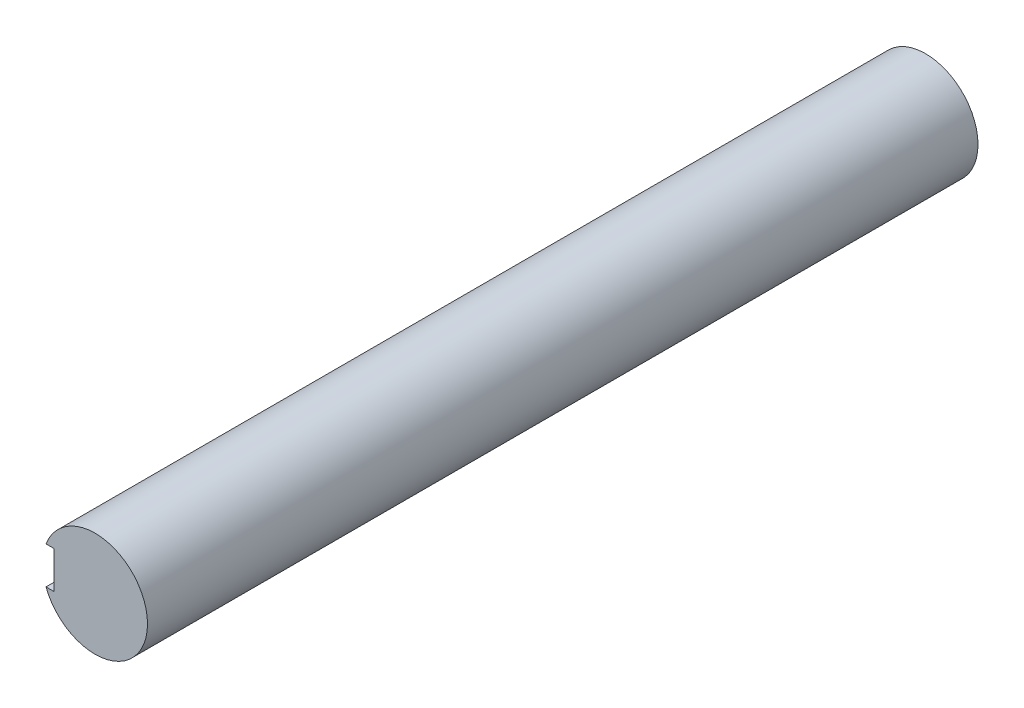
ISO-10303-21;
HEADER;
FILE_DESCRIPTION(('STEP AP214'),'2;1');
FILE_NAME('part.step','',(''),(''),'','','');
FILE_SCHEMA(('AUTOMOTIVE_DESIGN { 1 0 10303 214 1 1 1 1 }'));
ENDSEC;
DATA;
#1=APPLICATION_CONTEXT('core data for automotive mechanical design processes');
#2=APPLICATION_PROTOCOL_DEFINITION('international standard','automotive_design',2000,#1);
#3=PRODUCT_CONTEXT('',#1,'mechanical');
#4=PRODUCT('Part','Part','',(#3));
#5=PRODUCT_RELATED_PRODUCT_CATEGORY('part','',(#4));
#6=PRODUCT_DEFINITION_FORMATION('','',#4);
#7=PRODUCT_DEFINITION_CONTEXT('part definition',#1,'design');
#8=PRODUCT_DEFINITION('design','',#6,#7);
#9=PRODUCT_DEFINITION_SHAPE('','',#8);
#10=(LENGTH_UNIT() NAMED_UNIT(*) SI_UNIT(.MILLI.,.METRE.));
#11=(NAMED_UNIT(*) PLANE_ANGLE_UNIT() SI_UNIT($,.RADIAN.));
#12=(NAMED_UNIT(*) SI_UNIT($,.STERADIAN.) SOLID_ANGLE_UNIT());
#13=UNCERTAINTY_MEASURE_WITH_UNIT(LENGTH_MEASURE(1.E-05),#10,'distance_accuracy_value','');
#14=(GEOMETRIC_REPRESENTATION_CONTEXT(3) GLOBAL_UNCERTAINTY_ASSIGNED_CONTEXT((#13)) GLOBAL_UNIT_ASSIGNED_CONTEXT((#10,
#11,#12)) REPRESENTATION_CONTEXT('',''));
#15=CARTESIAN_POINT('',(0.,0.,0.));
#16=DIRECTION('',(0.,0.,1.));
#17=DIRECTION('',(1.,0.,0.));
#18=AXIS2_PLACEMENT_3D('',#15,#16,#17);
#19=CARTESIAN_POINT('',(-78.6475137895715,-368.822211524712,-10.));
#20=DIRECTION('',(0.,0.,1.));
#21=DIRECTION('',(1.,0.,0.));
#22=AXIS2_PLACEMENT_3D('',#19,#20,#21);
#23=CYLINDRICAL_SURFACE('',#22,6.);
#24=DIRECTION('',(0.,0.,1.));
#25=VECTOR('',#24,1.);
#26=CARTESIAN_POINT('',(-84.2568147629765,-366.692483234587,-10.));
#27=LINE('',#26,#25);
#28=CARTESIAN_POINT('',(-84.2568147629765,-366.692483234587,85.));
#29=VERTEX_POINT('',#28);
#30=CARTESIAN_POINT('',(-84.2568147629765,-366.692483234587,5.));
#31=VERTEX_POINT('',#30);
#32=EDGE_CURVE('E55',#29,#31,#27,.F.);
#33=ORIENTED_EDGE('',*,*,#32,.F.);
#34=CARTESIAN_POINT('',(-78.6475137895715,-368.822211524712,85.));
#35=DIRECTION('',(0.,0.,1.));
#36=DIRECTION('',(1.,0.,0.));
#37=AXIS2_PLACEMENT_3D('',#34,#35,#36);
#38=CIRCLE('',#37,6.);
#39=CARTESIAN_POINT('',(-84.2568147629765,-370.951939814837,85.));
#40=VERTEX_POINT('',#39);
#41=EDGE_CURVE('E100',#40,#29,#38,.T.);
#42=ORIENTED_EDGE('',*,*,#41,.F.);
#43=DIRECTION('',(0.,0.,1.));
#44=VECTOR('',#43,1.);
#45=CARTESIAN_POINT('',(-84.2568147629765,-370.951939814837,-10.));
#46=LINE('',#45,#44);
#47=CARTESIAN_POINT('',(-84.2568147629765,-370.951939814837,5.));
#48=VERTEX_POINT('',#47);
#49=EDGE_CURVE('E47',#48,#40,#46,.T.);
#50=ORIENTED_EDGE('',*,*,#49,.F.);
#51=CARTESIAN_POINT('',(-78.6475137895715,-368.822211524712,5.));
#52=DIRECTION('',(0.,0.,-1.));
#53=DIRECTION('',(-1.,0.,0.));
#54=AXIS2_PLACEMENT_3D('',#51,#52,#53);
#55=CIRCLE('',#54,6.);
#56=EDGE_CURVE('E11',#31,#48,#55,.F.);
#57=ORIENTED_EDGE('',*,*,#56,.F.);
#58=EDGE_LOOP('',(#33,#42,#50,#57));
#59=FACE_BOUND('',#58,.T.);
#60=CARTESIAN_POINT('',(-78.6475137895715,-368.822211524712,-10.));
#61=DIRECTION('',(0.,0.,1.));
#62=DIRECTION('',(1.,0.,0.));
#63=AXIS2_PLACEMENT_3D('',#60,#61,#62);
#64=CIRCLE('',#63,6.);
#65=CARTESIAN_POINT('',(-72.6475137895715,-368.822211524712,-10.));
#66=VERTEX_POINT('',#65);
#67=EDGE_CURVE('E103',#66,#66,#64,.T.);
#68=ORIENTED_EDGE('',*,*,#67,.T.);
#69=EDGE_LOOP('',(#68));
#70=FACE_BOUND('',#69,.T.);
#71=ADVANCED_FACE('F33',(#59,#70),#23,.T.);
#72=CARTESIAN_POINT('',(-78.6475137895715,-368.822211524712,-10.));
#73=DIRECTION('',(0.,0.,1.));
#74=DIRECTION('',(1.,0.,0.));
#75=AXIS2_PLACEMENT_3D('',#72,#73,#74);
#76=PLANE('',#75);
#77=ORIENTED_EDGE('',*,*,#67,.F.);
#78=EDGE_LOOP('',(#77));
#79=FACE_BOUND('',#78,.T.);
#80=ADVANCED_FACE('F108',(#79),#76,.F.);
#81=CARTESIAN_POINT('',(-78.6475137895715,-368.822211524712,85.));
#82=DIRECTION('',(0.,0.,1.));
#83=DIRECTION('',(1.,0.,0.));
#84=AXIS2_PLACEMENT_3D('',#81,#82,#83);
#85=PLANE('',#84);
#86=DIRECTION('',(-1.,0.,0.));
#87=VECTOR('',#86,1.);
#88=CARTESIAN_POINT('',(-85.5456459148569,-366.692483234587,85.));
#89=LINE('',#88,#87);
#90=CARTESIAN_POINT('',(-83.3424314402903,-366.692483234587,85.));
#91=VERTEX_POINT('',#90);
#92=EDGE_CURVE('E79',#91,#29,#89,.T.);
#93=ORIENTED_EDGE('',*,*,#92,.F.);
#94=DIRECTION('',(0.,1.,0.));
#95=VECTOR('',#94,1.);
#96=CARTESIAN_POINT('',(-83.3424314402903,-370.951939814837,85.));
#97=LINE('',#96,#95);
#98=CARTESIAN_POINT('',(-83.3424314402903,-370.951939814837,85.));
#99=VERTEX_POINT('',#98);
#100=EDGE_CURVE('E94',#99,#91,#97,.T.);
#101=ORIENTED_EDGE('',*,*,#100,.F.);
#102=DIRECTION('',(1.,0.,0.));
#103=VECTOR('',#102,1.);
#104=CARTESIAN_POINT('',(-78.6475137895715,-370.951939814837,85.));
#105=LINE('',#104,#103);
#106=EDGE_CURVE('E40',#40,#99,#105,.T.);
#107=ORIENTED_EDGE('',*,*,#106,.F.);
#108=ORIENTED_EDGE('',*,*,#41,.T.);
#109=EDGE_LOOP('',(#93,#101,#107,#108));
#110=FACE_BOUND('',#109,.T.);
#111=ADVANCED_FACE('F110',(#110),#85,.T.);
#112=CARTESIAN_POINT('',(-85.5456459148569,-366.692483234587,5.));
#113=DIRECTION('',(0.,1.,0.));
#114=DIRECTION('',(0.,0.,1.));
#115=AXIS2_PLACEMENT_3D('',#112,#113,#114);
#116=PLANE('',#115);
#117=ORIENTED_EDGE('',*,*,#32,.T.);
#118=DIRECTION('',(-1.,0.,0.));
#119=VECTOR('',#118,1.);
#120=CARTESIAN_POINT('',(-85.5456459148569,-366.692483234587,5.));
#121=LINE('',#120,#119);
#122=CARTESIAN_POINT('',(-83.3424314402903,-366.692483234587,5.));
#123=VERTEX_POINT('',#122);
#124=EDGE_CURVE('E88',#123,#31,#121,.T.);
#125=ORIENTED_EDGE('',*,*,#124,.F.);
#126=DIRECTION('',(0.,0.,1.));
#127=VECTOR('',#126,1.);
#128=CARTESIAN_POINT('',(-83.3424314402903,-366.692483234587,5.));
#129=LINE('',#128,#127);
#130=EDGE_CURVE('E87',#123,#91,#129,.T.);
#131=ORIENTED_EDGE('',*,*,#130,.T.);
#132=ORIENTED_EDGE('',*,*,#92,.T.);
#133=EDGE_LOOP('',(#117,#125,#131,#132));
#134=FACE_BOUND('',#133,.T.);
#135=ADVANCED_FACE('F115',(#134),#116,.F.);
#136=CARTESIAN_POINT('',(-83.3424314402903,-370.951939814837,5.));
#137=DIRECTION('',(1.,0.,0.));
#138=DIRECTION('',(0.,0.,-1.));
#139=AXIS2_PLACEMENT_3D('',#136,#137,#138);
#140=PLANE('',#139);
#141=ORIENTED_EDGE('',*,*,#100,.T.);
#142=ORIENTED_EDGE('',*,*,#130,.F.);
#143=DIRECTION('',(0.,1.,0.));
#144=VECTOR('',#143,1.);
#145=CARTESIAN_POINT('',(-83.3424314402903,-370.951939814837,5.));
#146=LINE('',#145,#144);
#147=CARTESIAN_POINT('',(-83.3424314402903,-370.951939814837,5.));
#148=VERTEX_POINT('',#147);
#149=EDGE_CURVE('E77',#148,#123,#146,.T.);
#150=ORIENTED_EDGE('',*,*,#149,.F.);
#151=DIRECTION('',(0.,0.,1.));
#152=VECTOR('',#151,1.);
#153=CARTESIAN_POINT('',(-83.3424314402903,-370.951939814837,5.));
#154=LINE('',#153,#152);
#155=EDGE_CURVE('E82',#148,#99,#154,.T.);
#156=ORIENTED_EDGE('',*,*,#155,.T.);
#157=EDGE_LOOP('',(#141,#142,#150,#156));
#158=FACE_BOUND('',#157,.T.);
#159=ADVANCED_FACE('F90',(#158),#140,.F.);
#160=CARTESIAN_POINT('',(-85.5456459148569,-370.951939814837,5.));
#161=DIRECTION('',(0.,-1.,0.));
#162=DIRECTION('',(0.,0.,-1.));
#163=AXIS2_PLACEMENT_3D('',#160,#161,#162);
#164=PLANE('',#163);
#165=ORIENTED_EDGE('',*,*,#49,.T.);
#166=ORIENTED_EDGE('',*,*,#106,.T.);
#167=ORIENTED_EDGE('',*,*,#155,.F.);
#168=DIRECTION('',(1.,0.,0.));
#169=VECTOR('',#168,1.);
#170=CARTESIAN_POINT('',(-85.5456459148569,-370.951939814837,5.));
#171=LINE('',#170,#169);
#172=EDGE_CURVE('E73',#48,#148,#171,.T.);
#173=ORIENTED_EDGE('',*,*,#172,.F.);
#174=EDGE_LOOP('',(#165,#166,#167,#173));
#175=FACE_BOUND('',#174,.T.);
#176=ADVANCED_FACE('F83',(#175),#164,.F.);
#177=CARTESIAN_POINT('',(0.,0.,5.));
#178=DIRECTION('',(0.,0.,-1.));
#179=DIRECTION('',(-1.,0.,0.));
#180=AXIS2_PLACEMENT_3D('',#177,#178,#179);
#181=PLANE('',#180);
#182=ORIENTED_EDGE('',*,*,#56,.T.);
#183=ORIENTED_EDGE('',*,*,#172,.T.);
#184=ORIENTED_EDGE('',*,*,#149,.T.);
#185=ORIENTED_EDGE('',*,*,#124,.T.);
#186=EDGE_LOOP('',(#182,#183,#184,#185));
#187=FACE_BOUND('',#186,.T.);
#188=ADVANCED_FACE('F75',(#187),#181,.F.);
#189=CLOSED_SHELL('',(#71,#80,#111,#135,#159,#176,#188));
#190=MANIFOLD_SOLID_BREP('B2',#189);
#191=ADVANCED_BREP_SHAPE_REPRESENTATION('',(#18,#190),#14);
#192=SHAPE_DEFINITION_REPRESENTATION(#9,#191);
ENDSEC;
END-ISO-10303-21;
